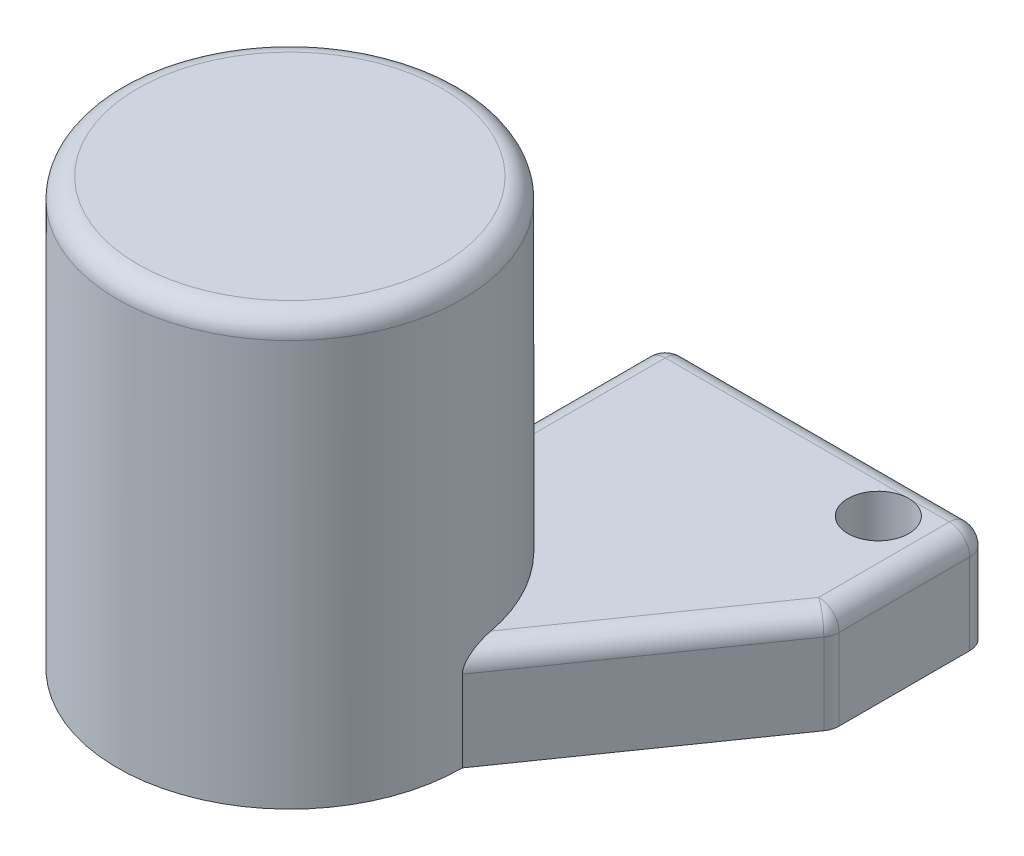
ISO-10303-21;
HEADER;
FILE_DESCRIPTION(('STEP AP214'),'2;1');
FILE_NAME('part.step','',(''),(''),'','','');
FILE_SCHEMA(('AUTOMOTIVE_DESIGN { 1 0 10303 214 1 1 1 1 }'));
ENDSEC;
DATA;
#1=APPLICATION_CONTEXT('core data for automotive mechanical design processes');
#2=APPLICATION_PROTOCOL_DEFINITION('international standard','automotive_design',2000,#1);
#3=PRODUCT_CONTEXT('',#1,'mechanical');
#4=PRODUCT('Part','Part','',(#3));
#5=PRODUCT_RELATED_PRODUCT_CATEGORY('part','',(#4));
#6=PRODUCT_DEFINITION_FORMATION('','',#4);
#7=PRODUCT_DEFINITION_CONTEXT('part definition',#1,'design');
#8=PRODUCT_DEFINITION('design','',#6,#7);
#9=PRODUCT_DEFINITION_SHAPE('','',#8);
#10=(LENGTH_UNIT() NAMED_UNIT(*) SI_UNIT(.MILLI.,.METRE.));
#11=(NAMED_UNIT(*) PLANE_ANGLE_UNIT() SI_UNIT($,.RADIAN.));
#12=(NAMED_UNIT(*) SI_UNIT($,.STERADIAN.) SOLID_ANGLE_UNIT());
#13=UNCERTAINTY_MEASURE_WITH_UNIT(LENGTH_MEASURE(1.E-05),#10,'distance_accuracy_value','');
#14=(GEOMETRIC_REPRESENTATION_CONTEXT(3) GLOBAL_UNCERTAINTY_ASSIGNED_CONTEXT((#13)) GLOBAL_UNIT_ASSIGNED_CONTEXT((#10,
#11,#12)) REPRESENTATION_CONTEXT('',''));
#15=CARTESIAN_POINT('',(0.,0.,0.));
#16=DIRECTION('',(0.,0.,1.));
#17=DIRECTION('',(1.,0.,0.));
#18=AXIS2_PLACEMENT_3D('',#15,#16,#17);
#19=CARTESIAN_POINT('',(0.,19.,0.));
#20=DIRECTION('',(0.,1.,0.));
#21=DIRECTION('',(0.,0.,1.));
#22=AXIS2_PLACEMENT_3D('',#19,#20,#21);
#23=PLANE('',#22);
#24=CARTESIAN_POINT('',(0.,19.,0.));
#25=DIRECTION('',(0.,-1.,0.));
#26=DIRECTION('',(0.,0.,-1.));
#27=AXIS2_PLACEMENT_3D('',#24,#25,#26);
#28=CIRCLE('',#27,6.5);
#29=CARTESIAN_POINT('',(0.,19.,-6.5));
#30=VERTEX_POINT('',#29);
#31=EDGE_CURVE('E148',#30,#30,#28,.T.);
#32=ORIENTED_EDGE('',*,*,#31,.T.);
#33=EDGE_LOOP('',(#32));
#34=FACE_BOUND('',#33,.T.);
#35=ADVANCED_FACE('F33',(#34),#23,.F.);
#36=CARTESIAN_POINT('',(0.,0.,0.));
#37=DIRECTION('',(0.,-1.,0.));
#38=DIRECTION('',(0.,0.,-1.));
#39=AXIS2_PLACEMENT_3D('',#36,#37,#38);
#40=CYLINDRICAL_SURFACE('',#39,6.5);
#41=ORIENTED_EDGE('',*,*,#31,.F.);
#42=EDGE_LOOP('',(#41));
#43=FACE_BOUND('',#42,.T.);
#44=CARTESIAN_POINT('',(0.,0.,0.));
#45=DIRECTION('',(0.,-1.,0.));
#46=DIRECTION('',(0.,0.,-1.));
#47=AXIS2_PLACEMENT_3D('',#44,#45,#46);
#48=CIRCLE('',#47,6.5);
#49=CARTESIAN_POINT('',(0.,0.,-6.5));
#50=VERTEX_POINT('',#49);
#51=EDGE_CURVE('E145',#50,#50,#48,.T.);
#52=ORIENTED_EDGE('',*,*,#51,.T.);
#53=EDGE_LOOP('',(#52));
#54=FACE_BOUND('',#53,.T.);
#55=ADVANCED_FACE('F252',(#43,#54),#40,.F.);
#56=CARTESIAN_POINT('',(-6.5,0.,0.));
#57=DIRECTION('',(0.,1.,0.));
#58=DIRECTION('',(0.,0.,1.));
#59=AXIS2_PLACEMENT_3D('',#56,#57,#58);
#60=PLANE('',#59);
#61=ORIENTED_EDGE('',*,*,#51,.F.);
#62=EDGE_LOOP('',(#61));
#63=FACE_BOUND('',#62,.T.);
#64=DIRECTION('',(0.,0.,1.));
#65=VECTOR('',#64,1.);
#66=CARTESIAN_POINT('',(16.,0.,-18.5));
#67=LINE('',#66,#65);
#68=CARTESIAN_POINT('',(16.,0.,-17.5));
#69=VERTEX_POINT('',#68);
#70=CARTESIAN_POINT('',(16.,0.,-11.0643635638558));
#71=VERTEX_POINT('',#70);
#72=EDGE_CURVE('E430',#69,#71,#67,.T.);
#73=ORIENTED_EDGE('',*,*,#72,.T.);
#74=CARTESIAN_POINT('',(15.,0.,-11.0643635638558));
#75=DIRECTION('',(0.,1.,0.));
#76=DIRECTION('',(0.,0.,1.));
#77=AXIS2_PLACEMENT_3D('',#74,#75,#76);
#78=CIRCLE('',#77,1.);
#79=CARTESIAN_POINT('',(15.8201269543012,0.,-10.4921819678317));
#80=VERTEX_POINT('',#79);
#81=EDGE_CURVE('E165',#71,#80,#78,.F.);
#82=ORIENTED_EDGE('',*,*,#81,.T.);
#83=DIRECTION('',(-0.572181596024081,0.,0.820126954301183));
#84=VECTOR('',#83,1.);
#85=CARTESIAN_POINT('',(16.,0.,-10.75));
#86=LINE('',#85,#84);
#87=CARTESIAN_POINT('',(8.5,0.,0.));
#88=VERTEX_POINT('',#87);
#89=EDGE_CURVE('E144',#80,#88,#86,.T.);
#90=ORIENTED_EDGE('',*,*,#89,.T.);
#91=CARTESIAN_POINT('',(0.,0.,0.));
#92=DIRECTION('',(0.,-1.,0.));
#93=DIRECTION('',(0.,0.,-1.));
#94=AXIS2_PLACEMENT_3D('',#91,#92,#93);
#95=CIRCLE('',#94,8.5);
#96=CARTESIAN_POINT('',(0.,0.,-8.5));
#97=VERTEX_POINT('',#96);
#98=EDGE_CURVE('E121',#88,#97,#95,.T.);
#99=ORIENTED_EDGE('',*,*,#98,.T.);
#100=DIRECTION('',(0.,0.,-1.));
#101=VECTOR('',#100,1.);
#102=CARTESIAN_POINT('',(0.,0.,-18.5));
#103=LINE('',#102,#101);
#104=CARTESIAN_POINT('',(0.,0.,-17.5));
#105=VERTEX_POINT('',#104);
#106=EDGE_CURVE('E130',#97,#105,#103,.T.);
#107=ORIENTED_EDGE('',*,*,#106,.T.);
#108=CARTESIAN_POINT('',(1.,0.,-17.5));
#109=DIRECTION('',(0.,1.,0.));
#110=DIRECTION('',(0.,0.,1.));
#111=AXIS2_PLACEMENT_3D('',#108,#109,#110);
#112=CIRCLE('',#111,1.);
#113=CARTESIAN_POINT('',(1.,0.,-18.5));
#114=VERTEX_POINT('',#113);
#115=EDGE_CURVE('E161',#105,#114,#112,.F.);
#116=ORIENTED_EDGE('',*,*,#115,.T.);
#117=DIRECTION('',(1.,0.,0.));
#118=VECTOR('',#117,1.);
#119=CARTESIAN_POINT('',(10.,0.,-18.5));
#120=LINE('',#119,#118);
#121=CARTESIAN_POINT('',(15.,0.,-18.5));
#122=VERTEX_POINT('',#121);
#123=EDGE_CURVE('E136',#114,#122,#120,.T.);
#124=ORIENTED_EDGE('',*,*,#123,.T.);
#125=CARTESIAN_POINT('',(15.,0.,-17.5));
#126=DIRECTION('',(0.,1.,0.));
#127=DIRECTION('',(0.,0.,1.));
#128=AXIS2_PLACEMENT_3D('',#125,#126,#127);
#129=CIRCLE('',#128,1.);
#130=EDGE_CURVE('E163',#122,#69,#129,.F.);
#131=ORIENTED_EDGE('',*,*,#130,.T.);
#132=EDGE_LOOP('',(#73,#82,#90,#99,#107,#116,#124,#131));
#133=FACE_BOUND('',#132,.T.);
#134=CARTESIAN_POINT('',(13.,0.,-16.));
#135=DIRECTION('',(0.,-1.,0.));
#136=DIRECTION('',(0.,0.,-1.));
#137=AXIS2_PLACEMENT_3D('',#134,#135,#136);
#138=CIRCLE('',#137,1.5);
#139=CARTESIAN_POINT('',(13.,0.,-17.5));
#140=VERTEX_POINT('',#139);
#141=EDGE_CURVE('E459',#140,#140,#138,.T.);
#142=ORIENTED_EDGE('',*,*,#141,.F.);
#143=EDGE_LOOP('',(#142));
#144=FACE_BOUND('',#143,.T.);
#145=ADVANCED_FACE('F141',(#63,#133,#144),#60,.F.);
#146=CARTESIAN_POINT('',(0.,0.,0.));
#147=DIRECTION('',(0.,-1.,0.));
#148=DIRECTION('',(0.,0.,-1.));
#149=AXIS2_PLACEMENT_3D('',#146,#147,#148);
#150=CYLINDRICAL_SURFACE('',#149,8.5);
#151=CARTESIAN_POINT('',(0.,20.,0.));
#152=DIRECTION('',(0.,-1.,0.));
#153=DIRECTION('',(0.,0.,-1.));
#154=AXIS2_PLACEMENT_3D('',#151,#152,#153);
#155=CIRCLE('',#154,8.5);
#156=CARTESIAN_POINT('',(0.,20.,-8.5));
#157=VERTEX_POINT('',#156);
#158=EDGE_CURVE('E188',#157,#157,#155,.T.);
#159=ORIENTED_EDGE('',*,*,#158,.T.);
#160=EDGE_LOOP('',(#159));
#161=FACE_BOUND('',#160,.T.);
#162=ORIENTED_EDGE('',*,*,#98,.F.);
#163=DIRECTION('',(0.,-1.,0.));
#164=VECTOR('',#163,1.);
#165=CARTESIAN_POINT('',(8.5,5.,0.));
#166=LINE('',#165,#164);
#167=CARTESIAN_POINT('',(8.5,4.,0.));
#168=VERTEX_POINT('',#167);
#169=EDGE_CURVE('E126',#168,#88,#166,.T.);
#170=ORIENTED_EDGE('',*,*,#169,.F.);
#171=CARTESIAN_POINT('',(8.5,4.,0.));
#172=CARTESIAN_POINT('',(8.49999437625777,4.03451869709922,8.47323626401811E-05));
#173=CARTESIAN_POINT('',(8.50000021784303,4.06892919838211,-0.00311958342223421));
#174=CARTESIAN_POINT('',(8.49998975977442,4.1363514303317,-0.0153265716351044));
#175=CARTESIAN_POINT('',(8.49997369012818,4.16937399785779,-0.0242684958739817));
#176=CARTESIAN_POINT('',(8.49986450843226,4.24120699245939,-0.049918859947787));
#177=CARTESIAN_POINT('',(8.49975402712411,4.27953247413809,-0.0679663564868391));
#178=CARTESIAN_POINT('',(8.49931404886318,4.35286353531419,-0.110035271139186));
#179=CARTESIAN_POINT('',(8.49898359040531,4.38785376567724,-0.134082624445465));
#180=CARTESIAN_POINT('',(8.49774100021788,4.471130827587,-0.199861289540403));
#181=CARTESIAN_POINT('',(8.49661919666046,4.51719105563666,-0.244384921488411));
#182=CARTESIAN_POINT('',(8.49334006626724,4.60204780075174,-0.339810514840479));
#183=CARTESIAN_POINT('',(8.49118054617173,4.64082869008371,-0.390725816163187));
#184=CARTESIAN_POINT('',(8.48623129736106,4.70424316349302,-0.485410145015529));
#185=CARTESIAN_POINT('',(8.48367621295757,4.73012685883222,-0.528368435769519));
#186=CARTESIAN_POINT('',(8.47774418110779,4.77816520476214,-0.616279205224493));
#187=CARTESIAN_POINT('',(8.4743667858874,4.800317812502,-0.661232759466702));
#188=CARTESIAN_POINT('',(8.46291509959604,4.86150833510508,-0.798409718205244));
#189=CARTESIAN_POINT('',(8.45352263268133,4.89526130701068,-0.892921980977872));
#190=CARTESIAN_POINT('',(8.43159079139591,4.94771211287286,-1.08013884497491));
#191=CARTESIAN_POINT('',(8.41924567700517,4.96711607411625,-1.17267160075125));
#192=CARTESIAN_POINT('',(8.39824460051025,4.98671164235863,-1.31213164666056));
#193=CARTESIAN_POINT('',(8.39085157331855,4.99165785186238,-1.35861321837925));
#194=CARTESIAN_POINT('',(8.37525257881295,4.99829919638684,-1.45168063856531));
#195=CARTESIAN_POINT('',(8.36704644536945,4.99999366558263,-1.49826650643369));
#196=CARTESIAN_POINT('',(8.35844432964915,5.,-1.54480043635288));
#197=B_SPLINE_CURVE_WITH_KNOTS('',3,(#171,#172,#173,#174,#175,#176,#177,#178,#179,#180,#181,
#182,#183,#184,#185,#186,#187,#188,#189,#190,#191,#192,#193,#194,#195,#196),.UNSPECIFIED.,.F.,
.F.,(4,2,2,2,2,2,2,2,2,2,2,2,4),(0.,0.103232519773969,0.205389684075052,0.331776968391045,
0.458720342361039,0.6498736644869,0.841432786552945,0.991889618048329,1.1424285619761,
1.44360325833453,1.72873646391478,1.8706060850979,2.01250475234502),.UNSPECIFIED.);
#198=CARTESIAN_POINT('',(8.35844432964914,5.,-1.54480043635288));
#199=VERTEX_POINT('',#198);
#200=EDGE_CURVE('E11',#168,#199,#197,.T.);
#201=ORIENTED_EDGE('',*,*,#200,.T.);
#202=CARTESIAN_POINT('',(0.,5.,0.));
#203=DIRECTION('',(0.,1.,0.));
#204=DIRECTION('',(0.,0.,1.));
#205=AXIS2_PLACEMENT_3D('',#202,#203,#204);
#206=CIRCLE('',#205,8.50000000000004);
#207=CARTESIAN_POINT('',(1.,5.,-8.44097150806706));
#208=VERTEX_POINT('',#207);
#209=EDGE_CURVE('E127',#199,#208,#206,.T.);
#210=ORIENTED_EDGE('',*,*,#209,.T.);
#211=CARTESIAN_POINT('',(1.,5.,-8.44097150806706));
#212=CARTESIAN_POINT('',(0.97207924296965,4.99999982079757,-8.44428003985996));
#213=CARTESIAN_POINT('',(0.94415466177856,4.99882986631455,-8.44744683385161));
#214=CARTESIAN_POINT('',(0.888469788675381,4.99415418415174,-8.45348472697136));
#215=CARTESIAN_POINT('',(0.860709496265035,4.99064846355955,-8.45635582699668));
#216=CARTESIAN_POINT('',(0.778018692631608,4.97664786725293,-8.4644988182893));
#217=CARTESIAN_POINT('',(0.723590171450048,4.96266952160352,-8.46931078630128));
#218=CARTESIAN_POINT('',(0.61774420437985,4.9257582908964,-8.47768960035925));
#219=CARTESIAN_POINT('',(0.566328890849551,4.90281915048502,-8.48125557329907));
#220=CARTESIAN_POINT('',(0.468025630430305,4.84861706319738,-8.48724791833063));
#221=CARTESIAN_POINT('',(0.42113656950333,4.81735617169249,-8.48967457141207));
#222=CARTESIAN_POINT('',(0.333404539374444,4.74751832318739,-8.49357210601843));
#223=CARTESIAN_POINT('',(0.292540298311085,4.70896825928897,-8.49504641554817));
#224=CARTESIAN_POINT('',(0.21781494058304,4.62555730644458,-8.49729119680709));
#225=CARTESIAN_POINT('',(0.183955385168609,4.58069501432341,-8.4980615117558));
#226=CARTESIAN_POINT('',(0.124162761958767,4.48585822392668,-8.49914600072343));
#227=CARTESIAN_POINT('',(0.0982436204041419,4.43587494674571,-8.49945937692033));
#228=CARTESIAN_POINT('',(0.0551554200044711,4.33228187321816,-8.499848514396));
#229=CARTESIAN_POINT('',(0.0379815338035276,4.27867409613878,-8.49992440688439));
#230=CARTESIAN_POINT('',(0.0169738226876484,4.18730452984505,-8.4999872595239));
#231=CARTESIAN_POINT('',(0.0106130454849317,4.15010376773954,-8.49999520673869));
#232=CARTESIAN_POINT('',(0.0021262868225049,4.07527377209286,-8.50000002106029));
#233=CARTESIAN_POINT('',(-5.45096848942172E-06,4.03764519118141,-8.49999690324437));
#234=CARTESIAN_POINT('',(0.,4.,-8.5));
#235=B_SPLINE_CURVE_WITH_KNOTS('',3,(#211,#212,#213,#214,#215,#216,#217,#218,#219,#220,#221,
#222,#223,#224,#225,#226,#227,#228,#229,#230,#231,#232,#233,#234),.UNSPECIFIED.,.F.,.F.,(4,2,2,
2,2,2,2,2,2,2,2,4),(0.,0.084297674481199,0.168595093172366,0.336927219850419,0.505377066458718,
0.673785346542285,0.841584004516696,1.00942002235675,1.17754873497336,1.34558454014463,
1.45858147720446,1.57142450335323),.UNSPECIFIED.);
#236=CARTESIAN_POINT('',(0.,4.,-8.5));
#237=VERTEX_POINT('',#236);
#238=EDGE_CURVE('E42',#208,#237,#235,.T.);
#239=ORIENTED_EDGE('',*,*,#238,.T.);
#240=DIRECTION('',(0.,-1.,0.));
#241=VECTOR('',#240,1.);
#242=CARTESIAN_POINT('',(0.,5.,-8.5));
#243=LINE('',#242,#241);
#244=EDGE_CURVE('E116',#237,#97,#243,.T.);
#245=ORIENTED_EDGE('',*,*,#244,.T.);
#246=EDGE_LOOP('',(#162,#170,#201,#210,#239,#245));
#247=FACE_BOUND('',#246,.T.);
#248=ADVANCED_FACE('F118',(#161,#247),#150,.T.);
#249=CARTESIAN_POINT('',(-8.5,21.,0.));
#250=DIRECTION('',(0.,-1.,0.));
#251=DIRECTION('',(0.,0.,-1.));
#252=AXIS2_PLACEMENT_3D('',#249,#250,#251);
#253=PLANE('',#252);
#254=CARTESIAN_POINT('',(0.,21.,0.));
#255=DIRECTION('',(0.,-1.,0.));
#256=DIRECTION('',(0.,0.,-1.));
#257=AXIS2_PLACEMENT_3D('',#254,#255,#256);
#258=CIRCLE('',#257,7.5);
#259=CARTESIAN_POINT('',(0.,21.,-7.5));
#260=VERTEX_POINT('',#259);
#261=EDGE_CURVE('E191',#260,#260,#258,.F.);
#262=ORIENTED_EDGE('',*,*,#261,.T.);
#263=EDGE_LOOP('',(#262));
#264=FACE_BOUND('',#263,.T.);
#265=ADVANCED_FACE('F261',(#264),#253,.F.);
#266=CARTESIAN_POINT('',(16.,5.,-10.75));
#267=DIRECTION('',(0.820126954301183,0.,0.572181596024081));
#268=DIRECTION('',(0.572181596024081,0.,-0.820126954301183));
#269=AXIS2_PLACEMENT_3D('',#266,#267,#268);
#270=PLANE('',#269);
#271=ORIENTED_EDGE('',*,*,#89,.F.);
#272=DIRECTION('',(0.,-1.,0.));
#273=VECTOR('',#272,1.);
#274=CARTESIAN_POINT('',(15.8201269543012,5.,-10.4921819678317));
#275=LINE('',#274,#273);
#276=CARTESIAN_POINT('',(15.8201269543012,4.,-10.4921819678317));
#277=VERTEX_POINT('',#276);
#278=EDGE_CURVE('E169',#80,#277,#275,.F.);
#279=ORIENTED_EDGE('',*,*,#278,.T.);
#280=DIRECTION('',(-0.572181596024081,0.,0.820126954301183));
#281=VECTOR('',#280,1.);
#282=CARTESIAN_POINT('',(16.,4.,-10.75));
#283=LINE('',#282,#281);
#284=EDGE_CURVE('E167',#277,#168,#283,.T.);
#285=ORIENTED_EDGE('',*,*,#284,.T.);
#286=ORIENTED_EDGE('',*,*,#169,.T.);
#287=EDGE_LOOP('',(#271,#279,#285,#286));
#288=FACE_BOUND('',#287,.T.);
#289=ADVANCED_FACE('F268',(#288),#270,.T.);
#290=CARTESIAN_POINT('',(16.,5.,-18.5));
#291=DIRECTION('',(1.,0.,0.));
#292=DIRECTION('',(0.,0.,-1.));
#293=AXIS2_PLACEMENT_3D('',#290,#291,#292);
#294=PLANE('',#293);
#295=DIRECTION('',(0.,0.,1.));
#296=VECTOR('',#295,1.);
#297=CARTESIAN_POINT('',(16.,4.,-18.5));
#298=LINE('',#297,#296);
#299=CARTESIAN_POINT('',(16.,4.,-17.5));
#300=VERTEX_POINT('',#299);
#301=CARTESIAN_POINT('',(16.,4.,-11.0643635638558));
#302=VERTEX_POINT('',#301);
#303=EDGE_CURVE('E154',#300,#302,#298,.T.);
#304=ORIENTED_EDGE('',*,*,#303,.T.);
#305=DIRECTION('',(0.,-1.,0.));
#306=VECTOR('',#305,1.);
#307=CARTESIAN_POINT('',(16.,5.,-11.0643635638558));
#308=LINE('',#307,#306);
#309=EDGE_CURVE('E158',#302,#71,#308,.T.);
#310=ORIENTED_EDGE('',*,*,#309,.T.);
#311=ORIENTED_EDGE('',*,*,#72,.F.);
#312=DIRECTION('',(0.,-1.,0.));
#313=VECTOR('',#312,1.);
#314=CARTESIAN_POINT('',(16.,5.,-17.5));
#315=LINE('',#314,#313);
#316=EDGE_CURVE('E156',#69,#300,#315,.F.);
#317=ORIENTED_EDGE('',*,*,#316,.T.);
#318=EDGE_LOOP('',(#304,#310,#311,#317));
#319=FACE_BOUND('',#318,.T.);
#320=ADVANCED_FACE('F344',(#319),#294,.T.);
#321=CARTESIAN_POINT('',(10.,5.,-18.5));
#322=DIRECTION('',(0.,0.,-1.));
#323=DIRECTION('',(-1.,0.,0.));
#324=AXIS2_PLACEMENT_3D('',#321,#322,#323);
#325=PLANE('',#324);
#326=DIRECTION('',(1.,0.,0.));
#327=VECTOR('',#326,1.);
#328=CARTESIAN_POINT('',(10.,4.,-18.5));
#329=LINE('',#328,#327);
#330=CARTESIAN_POINT('',(1.,4.,-18.5));
#331=VERTEX_POINT('',#330);
#332=CARTESIAN_POINT('',(15.,4.,-18.5));
#333=VERTEX_POINT('',#332);
#334=EDGE_CURVE('E171',#331,#333,#329,.T.);
#335=ORIENTED_EDGE('',*,*,#334,.T.);
#336=DIRECTION('',(0.,-1.,0.));
#337=VECTOR('',#336,1.);
#338=CARTESIAN_POINT('',(15.,5.,-18.5));
#339=LINE('',#338,#337);
#340=EDGE_CURVE('E175',#333,#122,#339,.T.);
#341=ORIENTED_EDGE('',*,*,#340,.T.);
#342=ORIENTED_EDGE('',*,*,#123,.F.);
#343=DIRECTION('',(0.,-1.,0.));
#344=VECTOR('',#343,1.);
#345=CARTESIAN_POINT('',(1.,5.,-18.5));
#346=LINE('',#345,#344);
#347=EDGE_CURVE('E173',#114,#331,#346,.F.);
#348=ORIENTED_EDGE('',*,*,#347,.T.);
#349=EDGE_LOOP('',(#335,#341,#342,#348));
#350=FACE_BOUND('',#349,.T.);
#351=ADVANCED_FACE('F337',(#350),#325,.T.);
#352=CARTESIAN_POINT('',(0.,5.,-18.5));
#353=DIRECTION('',(-1.,0.,0.));
#354=DIRECTION('',(0.,0.,1.));
#355=AXIS2_PLACEMENT_3D('',#352,#353,#354);
#356=PLANE('',#355);
#357=DIRECTION('',(0.,0.,-1.));
#358=VECTOR('',#357,1.);
#359=CARTESIAN_POINT('',(0.,4.,-18.5));
#360=LINE('',#359,#358);
#361=CARTESIAN_POINT('',(0.,4.,-17.5));
#362=VERTEX_POINT('',#361);
#363=EDGE_CURVE('E177',#237,#362,#360,.T.);
#364=ORIENTED_EDGE('',*,*,#363,.T.);
#365=DIRECTION('',(0.,-1.,0.));
#366=VECTOR('',#365,1.);
#367=CARTESIAN_POINT('',(0.,5.,-17.5));
#368=LINE('',#367,#366);
#369=EDGE_CURVE('E133',#362,#105,#368,.T.);
#370=ORIENTED_EDGE('',*,*,#369,.T.);
#371=ORIENTED_EDGE('',*,*,#106,.F.);
#372=ORIENTED_EDGE('',*,*,#244,.F.);
#373=EDGE_LOOP('',(#364,#370,#371,#372));
#374=FACE_BOUND('',#373,.T.);
#375=ADVANCED_FACE('F131',(#374),#356,.T.);
#376=CARTESIAN_POINT('',(0.,5.,0.));
#377=DIRECTION('',(0.,1.,0.));
#378=DIRECTION('',(0.,0.,1.));
#379=AXIS2_PLACEMENT_3D('',#376,#377,#378);
#380=PLANE('',#379);
#381=DIRECTION('',(1.,0.,0.));
#382=VECTOR('',#381,1.);
#383=CARTESIAN_POINT('',(0.,5.,-17.5));
#384=LINE('',#383,#382);
#385=CARTESIAN_POINT('',(13.,5.,-17.5));
#386=VERTEX_POINT('',#385);
#387=CARTESIAN_POINT('',(1.,5.,-17.5));
#388=VERTEX_POINT('',#387);
#389=EDGE_CURVE('E180',#386,#388,#384,.F.);
#390=ORIENTED_EDGE('',*,*,#389,.T.);
#391=DIRECTION('',(0.,0.,-1.));
#392=VECTOR('',#391,1.);
#393=CARTESIAN_POINT('',(1.,5.,0.));
#394=LINE('',#393,#392);
#395=EDGE_CURVE('E186',#388,#208,#394,.F.);
#396=ORIENTED_EDGE('',*,*,#395,.T.);
#397=ORIENTED_EDGE('',*,*,#209,.F.);
#398=DIRECTION('',(-0.572181596024081,0.,0.820126954301183));
#399=VECTOR('',#398,1.);
#400=CARTESIAN_POINT('',(4.89704292565513,5.,3.41654157603854));
#401=LINE('',#400,#399);
#402=CARTESIAN_POINT('',(15.,5.,-11.0643635638558));
#403=VERTEX_POINT('',#402);
#404=EDGE_CURVE('E50',#199,#403,#401,.F.);
#405=ORIENTED_EDGE('',*,*,#404,.T.);
#406=DIRECTION('',(0.,0.,1.));
#407=VECTOR('',#406,1.);
#408=CARTESIAN_POINT('',(15.,5.,0.));
#409=LINE('',#408,#407);
#410=CARTESIAN_POINT('',(15.,5.,-17.5));
#411=VERTEX_POINT('',#410);
#412=EDGE_CURVE('E54',#403,#411,#409,.F.);
#413=ORIENTED_EDGE('',*,*,#412,.T.);
#414=DIRECTION('',(1.,0.,0.));
#415=VECTOR('',#414,1.);
#416=CARTESIAN_POINT('',(0.,5.,-17.5));
#417=LINE('',#416,#415);
#418=EDGE_CURVE('E182',#411,#386,#417,.F.);
#419=ORIENTED_EDGE('',*,*,#418,.T.);
#420=CARTESIAN_POINT('',(13.,5.,-16.));
#421=DIRECTION('',(0.,-1.,0.));
#422=DIRECTION('',(0.,0.,-1.));
#423=AXIS2_PLACEMENT_3D('',#420,#421,#422);
#424=CIRCLE('',#423,1.5);
#425=EDGE_CURVE('E137',#386,#386,#424,.T.);
#426=ORIENTED_EDGE('',*,*,#425,.T.);
#427=EDGE_LOOP('',(#390,#396,#397,#405,#413,#419,#426));
#428=FACE_BOUND('',#427,.T.);
#429=ADVANCED_FACE('F323',(#428),#380,.T.);
#430=CARTESIAN_POINT('',(13.,5.,-16.));
#431=DIRECTION('',(0.,-1.,0.));
#432=DIRECTION('',(0.,0.,-1.));
#433=AXIS2_PLACEMENT_3D('',#430,#431,#432);
#434=CYLINDRICAL_SURFACE('',#433,1.5);
#435=ORIENTED_EDGE('',*,*,#425,.F.);
#436=EDGE_LOOP('',(#435));
#437=FACE_BOUND('',#436,.T.);
#438=ORIENTED_EDGE('',*,*,#141,.T.);
#439=EDGE_LOOP('',(#438));
#440=FACE_BOUND('',#439,.T.);
#441=ADVANCED_FACE('F213',(#437,#440),#434,.F.);
#442=CARTESIAN_POINT('',(1.,4.,-18.5));
#443=DIRECTION('',(0.,0.,-1.));
#444=DIRECTION('',(-1.,0.,0.));
#445=AXIS2_PLACEMENT_3D('',#442,#443,#444);
#446=CYLINDRICAL_SURFACE('',#445,1.);
#447=ORIENTED_EDGE('',*,*,#238,.F.);
#448=ORIENTED_EDGE('',*,*,#395,.F.);
#449=CARTESIAN_POINT('',(1.,4.,-17.5));
#450=DIRECTION('',(0.,0.,-1.));
#451=DIRECTION('',(0.,1.,0.));
#452=AXIS2_PLACEMENT_3D('',#449,#450,#451);
#453=CIRCLE('',#452,1.);
#454=EDGE_CURVE('E37',#362,#388,#453,.T.);
#455=ORIENTED_EDGE('',*,*,#454,.F.);
#456=ORIENTED_EDGE('',*,*,#363,.F.);
#457=EDGE_LOOP('',(#447,#448,#455,#456));
#458=FACE_BOUND('',#457,.T.);
#459=ADVANCED_FACE('F208',(#458),#446,.T.);
#460=CARTESIAN_POINT('',(1.,5.,-17.5));
#461=DIRECTION('',(0.,-1.,0.));
#462=DIRECTION('',(0.,0.,-1.));
#463=AXIS2_PLACEMENT_3D('',#460,#461,#462);
#464=CYLINDRICAL_SURFACE('',#463,1.);
#465=ORIENTED_EDGE('',*,*,#115,.F.);
#466=ORIENTED_EDGE('',*,*,#369,.F.);
#467=CARTESIAN_POINT('',(1.,4.,-17.5));
#468=DIRECTION('',(0.,1.,0.));
#469=DIRECTION('',(0.,0.,1.));
#470=AXIS2_PLACEMENT_3D('',#467,#468,#469);
#471=CIRCLE('',#470,1.);
#472=EDGE_CURVE('E454',#331,#362,#471,.T.);
#473=ORIENTED_EDGE('',*,*,#472,.F.);
#474=ORIENTED_EDGE('',*,*,#347,.F.);
#475=EDGE_LOOP('',(#465,#466,#473,#474));
#476=FACE_BOUND('',#475,.T.);
#477=ADVANCED_FACE('F212',(#476),#464,.T.);
#478=CARTESIAN_POINT('',(1.,4.,-17.5));
#479=DIRECTION('',(0.,0.,1.));
#480=DIRECTION('',(1.,0.,0.));
#481=AXIS2_PLACEMENT_3D('',#478,#479,#480);
#482=SPHERICAL_SURFACE('',#481,1.);
#483=ORIENTED_EDGE('',*,*,#472,.T.);
#484=ORIENTED_EDGE('',*,*,#454,.T.);
#485=CARTESIAN_POINT('',(1.,4.,-17.5));
#486=DIRECTION('',(-1.,0.,0.));
#487=DIRECTION('',(0.,0.,1.));
#488=AXIS2_PLACEMENT_3D('',#485,#486,#487);
#489=CIRCLE('',#488,1.);
#490=EDGE_CURVE('E452',#331,#388,#489,.F.);
#491=ORIENTED_EDGE('',*,*,#490,.F.);
#492=EDGE_LOOP('',(#483,#484,#491));
#493=FACE_BOUND('',#492,.T.);
#494=ADVANCED_FACE('F217',(#493),#482,.T.);
#495=CARTESIAN_POINT('',(10.,4.,-17.5));
#496=DIRECTION('',(1.,0.,0.));
#497=DIRECTION('',(0.,0.,-1.));
#498=AXIS2_PLACEMENT_3D('',#495,#496,#497);
#499=CYLINDRICAL_SURFACE('',#498,1.);
#500=ORIENTED_EDGE('',*,*,#389,.F.);
#501=ORIENTED_EDGE('',*,*,#418,.F.);
#502=CARTESIAN_POINT('',(15.,4.,-17.5));
#503=DIRECTION('',(1.,0.,0.));
#504=DIRECTION('',(0.,0.,-1.));
#505=AXIS2_PLACEMENT_3D('',#502,#503,#504);
#506=CIRCLE('',#505,1.);
#507=EDGE_CURVE('E449',#333,#411,#506,.T.);
#508=ORIENTED_EDGE('',*,*,#507,.F.);
#509=ORIENTED_EDGE('',*,*,#334,.F.);
#510=ORIENTED_EDGE('',*,*,#490,.T.);
#511=EDGE_LOOP('',(#500,#501,#508,#509,#510));
#512=FACE_BOUND('',#511,.T.);
#513=ADVANCED_FACE('F221',(#512),#499,.T.);
#514=CARTESIAN_POINT('',(15.,5.,-17.5));
#515=DIRECTION('',(0.,-1.,0.));
#516=DIRECTION('',(0.,0.,-1.));
#517=AXIS2_PLACEMENT_3D('',#514,#515,#516);
#518=CYLINDRICAL_SURFACE('',#517,1.);
#519=ORIENTED_EDGE('',*,*,#130,.F.);
#520=ORIENTED_EDGE('',*,*,#340,.F.);
#521=CARTESIAN_POINT('',(15.,4.,-17.5));
#522=DIRECTION('',(0.,1.,0.));
#523=DIRECTION('',(0.,0.,1.));
#524=AXIS2_PLACEMENT_3D('',#521,#522,#523);
#525=CIRCLE('',#524,1.);
#526=EDGE_CURVE('E446',#300,#333,#525,.T.);
#527=ORIENTED_EDGE('',*,*,#526,.F.);
#528=ORIENTED_EDGE('',*,*,#316,.F.);
#529=EDGE_LOOP('',(#519,#520,#527,#528));
#530=FACE_BOUND('',#529,.T.);
#531=ADVANCED_FACE('F225',(#530),#518,.T.);
#532=CARTESIAN_POINT('',(15.,4.,-17.5));
#533=DIRECTION('',(0.,0.,1.));
#534=DIRECTION('',(1.,0.,0.));
#535=AXIS2_PLACEMENT_3D('',#532,#533,#534);
#536=SPHERICAL_SURFACE('',#535,1.);
#537=ORIENTED_EDGE('',*,*,#526,.T.);
#538=ORIENTED_EDGE('',*,*,#507,.T.);
#539=CARTESIAN_POINT('',(15.,4.,-17.5));
#540=DIRECTION('',(0.,0.,-1.));
#541=DIRECTION('',(-1.,0.,0.));
#542=AXIS2_PLACEMENT_3D('',#539,#540,#541);
#543=CIRCLE('',#542,1.);
#544=EDGE_CURVE('E443',#300,#411,#543,.F.);
#545=ORIENTED_EDGE('',*,*,#544,.F.);
#546=EDGE_LOOP('',(#537,#538,#545));
#547=FACE_BOUND('',#546,.T.);
#548=ADVANCED_FACE('F229',(#547),#536,.T.);
#549=CARTESIAN_POINT('',(15.1798730456988,4.,-11.3221815960241));
#550=DIRECTION('',(-0.572181596024081,0.,0.820126954301183));
#551=DIRECTION('',(0.820126954301183,0.,0.572181596024081));
#552=AXIS2_PLACEMENT_3D('',#549,#550,#551);
#553=CYLINDRICAL_SURFACE('',#552,1.);
#554=ORIENTED_EDGE('',*,*,#200,.F.);
#555=ORIENTED_EDGE('',*,*,#284,.F.);
#556=CARTESIAN_POINT('',(15.,4.,-11.0643635638558));
#557=DIRECTION('',(0.572181596024083,0.,-0.820126954301182));
#558=DIRECTION('',(-0.820126954301182,0.,-0.572181596024083));
#559=AXIS2_PLACEMENT_3D('',#556,#557,#558);
#560=CIRCLE('',#559,1.);
#561=EDGE_CURVE('E439',#403,#277,#560,.T.);
#562=ORIENTED_EDGE('',*,*,#561,.F.);
#563=ORIENTED_EDGE('',*,*,#404,.F.);
#564=EDGE_LOOP('',(#554,#555,#562,#563));
#565=FACE_BOUND('',#564,.T.);
#566=ADVANCED_FACE('F232',(#565),#553,.T.);
#567=CARTESIAN_POINT('',(15.,4.,-18.5));
#568=DIRECTION('',(0.,0.,1.));
#569=DIRECTION('',(1.,0.,0.));
#570=AXIS2_PLACEMENT_3D('',#567,#568,#569);
#571=CYLINDRICAL_SURFACE('',#570,1.);
#572=ORIENTED_EDGE('',*,*,#544,.T.);
#573=ORIENTED_EDGE('',*,*,#412,.F.);
#574=CARTESIAN_POINT('',(15.,4.,-11.0643635638558));
#575=DIRECTION('',(0.,0.,1.));
#576=DIRECTION('',(0.,-1.,0.));
#577=AXIS2_PLACEMENT_3D('',#574,#575,#576);
#578=CIRCLE('',#577,1.);
#579=EDGE_CURVE('E438',#302,#403,#578,.T.);
#580=ORIENTED_EDGE('',*,*,#579,.F.);
#581=ORIENTED_EDGE('',*,*,#303,.F.);
#582=EDGE_LOOP('',(#572,#573,#580,#581));
#583=FACE_BOUND('',#582,.T.);
#584=ADVANCED_FACE('F237',(#583),#571,.T.);
#585=CARTESIAN_POINT('',(15.,4.,-11.0643635638558));
#586=DIRECTION('',(0.,0.,1.));
#587=DIRECTION('',(1.,0.,0.));
#588=AXIS2_PLACEMENT_3D('',#585,#586,#587);
#589=SPHERICAL_SURFACE('',#588,1.);
#590=ORIENTED_EDGE('',*,*,#579,.T.);
#591=ORIENTED_EDGE('',*,*,#561,.T.);
#592=CARTESIAN_POINT('',(15.,4.,-11.0643635638558));
#593=DIRECTION('',(0.,1.,0.));
#594=DIRECTION('',(0.,0.,1.));
#595=AXIS2_PLACEMENT_3D('',#592,#593,#594);
#596=CIRCLE('',#595,1.);
#597=EDGE_CURVE('E435',#302,#277,#596,.F.);
#598=ORIENTED_EDGE('',*,*,#597,.F.);
#599=EDGE_LOOP('',(#590,#591,#598));
#600=FACE_BOUND('',#599,.T.);
#601=ADVANCED_FACE('F241',(#600),#589,.T.);
#602=CARTESIAN_POINT('',(15.,5.,-11.0643635638558));
#603=DIRECTION('',(0.,-1.,0.));
#604=DIRECTION('',(0.,0.,-1.));
#605=AXIS2_PLACEMENT_3D('',#602,#603,#604);
#606=CYLINDRICAL_SURFACE('',#605,1.);
#607=ORIENTED_EDGE('',*,*,#597,.T.);
#608=ORIENTED_EDGE('',*,*,#278,.F.);
#609=ORIENTED_EDGE('',*,*,#81,.F.);
#610=ORIENTED_EDGE('',*,*,#309,.F.);
#611=EDGE_LOOP('',(#607,#608,#609,#610));
#612=FACE_BOUND('',#611,.T.);
#613=ADVANCED_FACE('F245',(#612),#606,.T.);
#614=CARTESIAN_POINT('',(0.,20.,0.));
#615=DIRECTION('',(0.,-1.,0.));
#616=DIRECTION('',(0.,0.,-1.));
#617=AXIS2_PLACEMENT_3D('',#614,#615,#616);
#618=TOROIDAL_SURFACE('',#617,7.5,1.);
#619=ORIENTED_EDGE('',*,*,#261,.F.);
#620=EDGE_LOOP('',(#619));
#621=FACE_BOUND('',#620,.T.);
#622=ORIENTED_EDGE('',*,*,#158,.F.);
#623=EDGE_LOOP('',(#622));
#624=FACE_BOUND('',#623,.T.);
#625=ADVANCED_FACE('F35',(#621,#624),#618,.T.);
#626=CLOSED_SHELL('',(#35,#55,#145,#248,#265,#289,#320,#351,#375,#429,#441,#459,#477,#494,#513,
#531,#548,#566,#584,#601,#613,#625));
#627=MANIFOLD_SOLID_BREP('B2',#626);
#628=ADVANCED_BREP_SHAPE_REPRESENTATION('',(#18,#627),#14);
#629=SHAPE_DEFINITION_REPRESENTATION(#9,#628);
ENDSEC;
END-ISO-10303-21;
